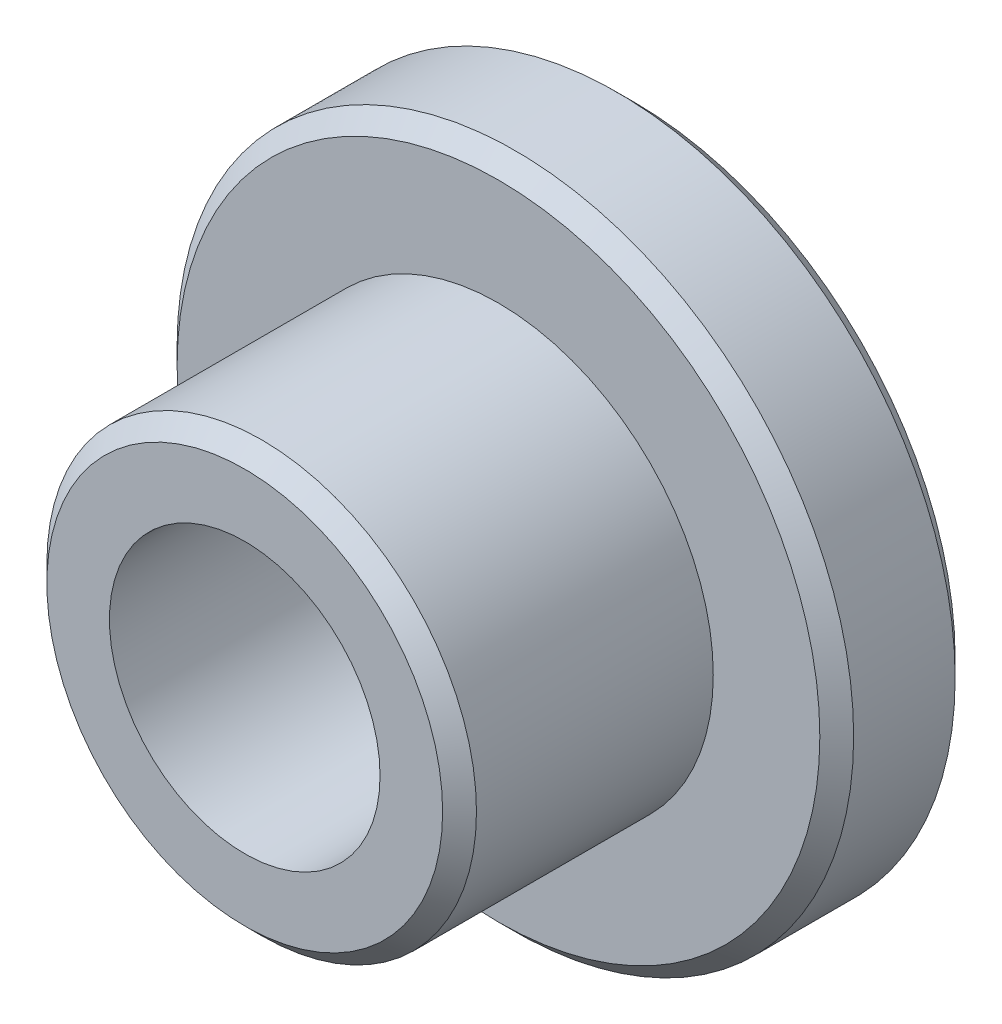
ISO-10303-21;
HEADER;
FILE_DESCRIPTION(('STEP AP214'),'2;1');
FILE_NAME('part.step','',(''),(''),'','','');
FILE_SCHEMA(('AUTOMOTIVE_DESIGN { 1 0 10303 214 1 1 1 1 }'));
ENDSEC;
DATA;
#1=APPLICATION_CONTEXT('core data for automotive mechanical design processes');
#2=APPLICATION_PROTOCOL_DEFINITION('international standard','automotive_design',2000,#1);
#3=PRODUCT_CONTEXT('',#1,'mechanical');
#4=PRODUCT('Part','Part','',(#3));
#5=PRODUCT_RELATED_PRODUCT_CATEGORY('part','',(#4));
#6=PRODUCT_DEFINITION_FORMATION('','',#4);
#7=PRODUCT_DEFINITION_CONTEXT('part definition',#1,'design');
#8=PRODUCT_DEFINITION('design','',#6,#7);
#9=PRODUCT_DEFINITION_SHAPE('','',#8);
#10=(LENGTH_UNIT() NAMED_UNIT(*) SI_UNIT(.MILLI.,.METRE.));
#11=(NAMED_UNIT(*) PLANE_ANGLE_UNIT() SI_UNIT($,.RADIAN.));
#12=(NAMED_UNIT(*) SI_UNIT($,.STERADIAN.) SOLID_ANGLE_UNIT());
#13=UNCERTAINTY_MEASURE_WITH_UNIT(LENGTH_MEASURE(1.E-05),#10,'distance_accuracy_value','');
#14=(GEOMETRIC_REPRESENTATION_CONTEXT(3) GLOBAL_UNCERTAINTY_ASSIGNED_CONTEXT((#13)) GLOBAL_UNIT_ASSIGNED_CONTEXT((#10,
#11,#12)) REPRESENTATION_CONTEXT('',''));
#15=CARTESIAN_POINT('',(0.,0.,0.));
#16=DIRECTION('',(0.,0.,1.));
#17=DIRECTION('',(1.,0.,0.));
#18=AXIS2_PLACEMENT_3D('',#15,#16,#17);
#19=CARTESIAN_POINT('',(0.,0.,8.));
#20=DIRECTION('',(0.,0.,-1.));
#21=DIRECTION('',(-1.,0.,0.));
#22=AXIS2_PLACEMENT_3D('',#19,#20,#21);
#23=CYLINDRICAL_SURFACE('',#22,20.);
#24=CARTESIAN_POINT('',(0.,0.,6.99999999999999));
#25=DIRECTION('',(0.,0.,1.));
#26=DIRECTION('',(1.,0.,0.));
#27=AXIS2_PLACEMENT_3D('',#24,#25,#26);
#28=CIRCLE('',#27,20.);
#29=CARTESIAN_POINT('',(20.,0.,6.99999999999999));
#30=VERTEX_POINT('',#29);
#31=EDGE_CURVE('E57',#30,#30,#28,.F.);
#32=ORIENTED_EDGE('',*,*,#31,.T.);
#33=EDGE_LOOP('',(#32));
#34=FACE_BOUND('',#33,.T.);
#35=CARTESIAN_POINT('',(0.,0.,1.));
#36=DIRECTION('',(0.,0.,1.));
#37=DIRECTION('',(1.,0.,0.));
#38=AXIS2_PLACEMENT_3D('',#35,#36,#37);
#39=CIRCLE('',#38,20.);
#40=CARTESIAN_POINT('',(20.,0.,1.));
#41=VERTEX_POINT('',#40);
#42=EDGE_CURVE('E66',#41,#41,#39,.T.);
#43=ORIENTED_EDGE('',*,*,#42,.T.);
#44=EDGE_LOOP('',(#43));
#45=FACE_BOUND('',#44,.T.);
#46=ADVANCED_FACE('F48',(#34,#45),#23,.T.);
#47=CARTESIAN_POINT('',(0.,0.,8.));
#48=DIRECTION('',(0.,0.,1.));
#49=DIRECTION('',(1.,0.,0.));
#50=AXIS2_PLACEMENT_3D('',#47,#48,#49);
#51=PLANE('',#50);
#52=CARTESIAN_POINT('',(0.,0.,8.));
#53=DIRECTION('',(0.,0.,1.));
#54=DIRECTION('',(1.,0.,0.));
#55=AXIS2_PLACEMENT_3D('',#52,#53,#54);
#56=CIRCLE('',#55,19.);
#57=CARTESIAN_POINT('',(19.,0.,8.));
#58=VERTEX_POINT('',#57);
#59=EDGE_CURVE('E71',#58,#58,#56,.T.);
#60=ORIENTED_EDGE('',*,*,#59,.T.);
#61=EDGE_LOOP('',(#60));
#62=FACE_BOUND('',#61,.T.);
#63=CARTESIAN_POINT('',(0.,0.,8.));
#64=DIRECTION('',(0.,0.,1.));
#65=DIRECTION('',(1.,0.,0.));
#66=AXIS2_PLACEMENT_3D('',#63,#64,#65);
#67=CIRCLE('',#66,12.7);
#68=CARTESIAN_POINT('',(12.7,0.,8.));
#69=VERTEX_POINT('',#68);
#70=EDGE_CURVE('E91',#69,#69,#67,.T.);
#71=ORIENTED_EDGE('',*,*,#70,.F.);
#72=EDGE_LOOP('',(#71));
#73=FACE_BOUND('',#72,.T.);
#74=ADVANCED_FACE('F111',(#62,#73),#51,.T.);
#75=CARTESIAN_POINT('',(0.,0.,0.));
#76=DIRECTION('',(0.,0.,1.));
#77=DIRECTION('',(1.,0.,0.));
#78=AXIS2_PLACEMENT_3D('',#75,#76,#77);
#79=PLANE('',#78);
#80=CARTESIAN_POINT('',(0.,0.,0.));
#81=DIRECTION('',(0.,0.,1.));
#82=DIRECTION('',(1.,0.,0.));
#83=AXIS2_PLACEMENT_3D('',#80,#81,#82);
#84=CIRCLE('',#83,19.);
#85=CARTESIAN_POINT('',(19.,0.,0.));
#86=VERTEX_POINT('',#85);
#87=EDGE_CURVE('E10',#86,#86,#84,.F.);
#88=ORIENTED_EDGE('',*,*,#87,.T.);
#89=EDGE_LOOP('',(#88));
#90=FACE_BOUND('',#89,.T.);
#91=CARTESIAN_POINT('',(0.,0.,0.));
#92=DIRECTION('',(0.,0.,-1.));
#93=DIRECTION('',(-1.,0.,0.));
#94=AXIS2_PLACEMENT_3D('',#91,#92,#93);
#95=CIRCLE('',#94,6.);
#96=CARTESIAN_POINT('',(-6.,0.,0.));
#97=VERTEX_POINT('',#96);
#98=EDGE_CURVE('E83',#97,#97,#95,.T.);
#99=ORIENTED_EDGE('',*,*,#98,.F.);
#100=EDGE_LOOP('',(#99));
#101=FACE_BOUND('',#100,.T.);
#102=ADVANCED_FACE('F108',(#90,#101),#79,.F.);
#103=CARTESIAN_POINT('',(0.,0.,23.));
#104=DIRECTION('',(0.,0.,-1.));
#105=DIRECTION('',(-1.,0.,0.));
#106=AXIS2_PLACEMENT_3D('',#103,#104,#105);
#107=CYLINDRICAL_SURFACE('',#106,12.7);
#108=CARTESIAN_POINT('',(0.,0.,22.));
#109=DIRECTION('',(0.,0.,1.));
#110=DIRECTION('',(1.,0.,0.));
#111=AXIS2_PLACEMENT_3D('',#108,#109,#110);
#112=CIRCLE('',#111,12.7);
#113=CARTESIAN_POINT('',(12.7,0.,22.));
#114=VERTEX_POINT('',#113);
#115=EDGE_CURVE('E77',#114,#114,#112,.F.);
#116=ORIENTED_EDGE('',*,*,#115,.T.);
#117=EDGE_LOOP('',(#116));
#118=FACE_BOUND('',#117,.T.);
#119=ORIENTED_EDGE('',*,*,#70,.T.);
#120=EDGE_LOOP('',(#119));
#121=FACE_BOUND('',#120,.T.);
#122=ADVANCED_FACE('F110',(#118,#121),#107,.T.);
#123=CARTESIAN_POINT('',(0.,0.,23.));
#124=DIRECTION('',(0.,0.,1.));
#125=DIRECTION('',(1.,0.,0.));
#126=AXIS2_PLACEMENT_3D('',#123,#124,#125);
#127=PLANE('',#126);
#128=CARTESIAN_POINT('',(0.,0.,23.));
#129=DIRECTION('',(0.,0.,1.));
#130=DIRECTION('',(1.,0.,0.));
#131=AXIS2_PLACEMENT_3D('',#128,#129,#130);
#132=CIRCLE('',#131,8.);
#133=CARTESIAN_POINT('',(8.,0.,23.));
#134=VERTEX_POINT('',#133);
#135=EDGE_CURVE('E82',#134,#134,#132,.T.);
#136=ORIENTED_EDGE('',*,*,#135,.F.);
#137=EDGE_LOOP('',(#136));
#138=FACE_BOUND('',#137,.T.);
#139=CARTESIAN_POINT('',(0.,0.,23.));
#140=DIRECTION('',(0.,0.,1.));
#141=DIRECTION('',(1.,0.,0.));
#142=AXIS2_PLACEMENT_3D('',#139,#140,#141);
#143=CIRCLE('',#142,11.7);
#144=CARTESIAN_POINT('',(11.7,0.,23.));
#145=VERTEX_POINT('',#144);
#146=EDGE_CURVE('E87',#145,#145,#143,.T.);
#147=ORIENTED_EDGE('',*,*,#146,.T.);
#148=EDGE_LOOP('',(#147));
#149=FACE_BOUND('',#148,.T.);
#150=ADVANCED_FACE('F117',(#138,#149),#127,.T.);
#151=CARTESIAN_POINT('',(0.,0.,23.));
#152=DIRECTION('',(0.,0.,-1.));
#153=DIRECTION('',(-1.,0.,0.));
#154=AXIS2_PLACEMENT_3D('',#151,#152,#153);
#155=CONICAL_SURFACE('',#154,11.7,0.785398163397447);
#156=ORIENTED_EDGE('',*,*,#115,.F.);
#157=EDGE_LOOP('',(#156));
#158=FACE_BOUND('',#157,.T.);
#159=ORIENTED_EDGE('',*,*,#146,.F.);
#160=EDGE_LOOP('',(#159));
#161=FACE_BOUND('',#160,.T.);
#162=ADVANCED_FACE('F129',(#158,#161),#155,.T.);
#163=CARTESIAN_POINT('',(0.,0.,8.));
#164=DIRECTION('',(0.,0.,1.));
#165=DIRECTION('',(1.,0.,0.));
#166=AXIS2_PLACEMENT_3D('',#163,#164,#165);
#167=CYLINDRICAL_SURFACE('',#166,8.);
#168=CARTESIAN_POINT('',(0.,0.,8.));
#169=DIRECTION('',(0.,0.,1.));
#170=DIRECTION('',(1.,0.,0.));
#171=AXIS2_PLACEMENT_3D('',#168,#169,#170);
#172=CIRCLE('',#171,8.);
#173=CARTESIAN_POINT('',(8.,0.,8.));
#174=VERTEX_POINT('',#173);
#175=EDGE_CURVE('E95',#174,#174,#172,.T.);
#176=ORIENTED_EDGE('',*,*,#175,.F.);
#177=EDGE_LOOP('',(#176));
#178=FACE_BOUND('',#177,.T.);
#179=ORIENTED_EDGE('',*,*,#135,.T.);
#180=EDGE_LOOP('',(#179));
#181=FACE_BOUND('',#180,.T.);
#182=ADVANCED_FACE('F134',(#178,#181),#167,.F.);
#183=CARTESIAN_POINT('',(0.,0.,8.));
#184=DIRECTION('',(0.,0.,1.));
#185=DIRECTION('',(1.,0.,0.));
#186=AXIS2_PLACEMENT_3D('',#183,#184,#185);
#187=PLANE('',#186);
#188=CARTESIAN_POINT('',(0.,0.,8.));
#189=DIRECTION('',(0.,0.,1.));
#190=DIRECTION('',(1.,0.,0.));
#191=AXIS2_PLACEMENT_3D('',#188,#189,#190);
#192=CIRCLE('',#191,6.);
#193=CARTESIAN_POINT('',(6.,0.,8.));
#194=VERTEX_POINT('',#193);
#195=EDGE_CURVE('E78',#194,#194,#192,.T.);
#196=ORIENTED_EDGE('',*,*,#195,.F.);
#197=EDGE_LOOP('',(#196));
#198=FACE_BOUND('',#197,.T.);
#199=ORIENTED_EDGE('',*,*,#175,.T.);
#200=EDGE_LOOP('',(#199));
#201=FACE_BOUND('',#200,.T.);
#202=ADVANCED_FACE('F146',(#198,#201),#187,.T.);
#203=CARTESIAN_POINT('',(0.,0.,23.));
#204=DIRECTION('',(0.,0.,-1.));
#205=DIRECTION('',(-1.,0.,0.));
#206=AXIS2_PLACEMENT_3D('',#203,#204,#205);
#207=CYLINDRICAL_SURFACE('',#206,6.);
#208=ORIENTED_EDGE('',*,*,#195,.T.);
#209=EDGE_LOOP('',(#208));
#210=FACE_BOUND('',#209,.T.);
#211=ORIENTED_EDGE('',*,*,#98,.T.);
#212=EDGE_LOOP('',(#211));
#213=FACE_BOUND('',#212,.T.);
#214=ADVANCED_FACE('F106',(#210,#213),#207,.F.);
#215=CARTESIAN_POINT('',(0.,0.,8.));
#216=DIRECTION('',(0.,0.,-1.));
#217=DIRECTION('',(-1.,0.,0.));
#218=AXIS2_PLACEMENT_3D('',#215,#216,#217);
#219=CONICAL_SURFACE('',#218,19.,0.785398163397448);
#220=ORIENTED_EDGE('',*,*,#31,.F.);
#221=EDGE_LOOP('',(#220));
#222=FACE_BOUND('',#221,.T.);
#223=ORIENTED_EDGE('',*,*,#59,.F.);
#224=EDGE_LOOP('',(#223));
#225=FACE_BOUND('',#224,.T.);
#226=ADVANCED_FACE('F136',(#222,#225),#219,.T.);
#227=CARTESIAN_POINT('',(0.,0.,1.));
#228=DIRECTION('',(0.,0.,1.));
#229=DIRECTION('',(1.,0.,0.));
#230=AXIS2_PLACEMENT_3D('',#227,#228,#229);
#231=CONICAL_SURFACE('',#230,20.,0.785398163397448);
#232=ORIENTED_EDGE('',*,*,#87,.F.);
#233=EDGE_LOOP('',(#232));
#234=FACE_BOUND('',#233,.T.);
#235=ORIENTED_EDGE('',*,*,#42,.F.);
#236=EDGE_LOOP('',(#235));
#237=FACE_BOUND('',#236,.T.);
#238=ADVANCED_FACE('F51',(#234,#237),#231,.T.);
#239=CLOSED_SHELL('',(#46,#74,#102,#122,#150,#162,#182,#202,#214,#226,#238));
#240=MANIFOLD_SOLID_BREP('B2',#239);
#241=ADVANCED_BREP_SHAPE_REPRESENTATION('',(#18,#240),#14);
#242=SHAPE_DEFINITION_REPRESENTATION(#9,#241);
ENDSEC;
END-ISO-10303-21;
